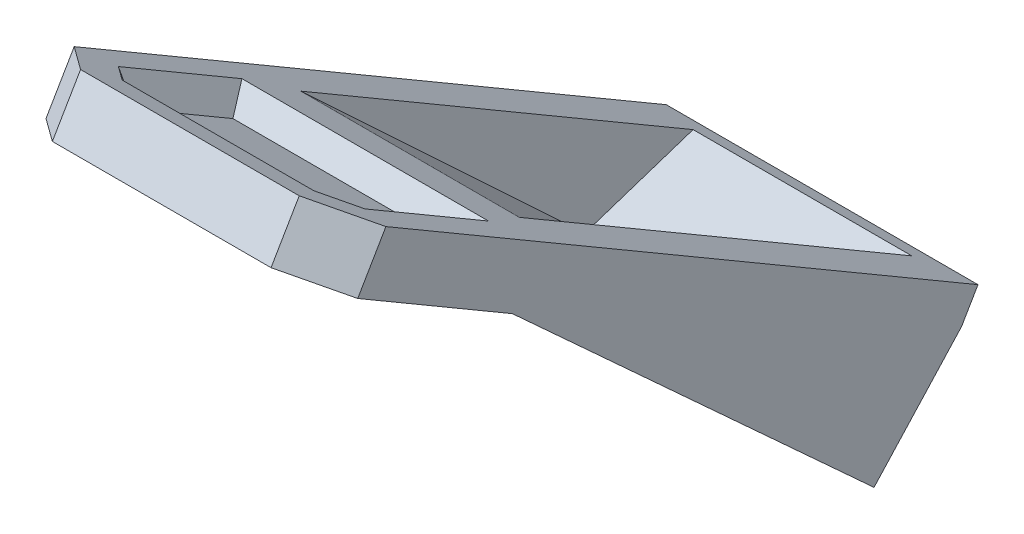
ISO-10303-21;
HEADER;
FILE_DESCRIPTION(('STEP AP214'),'2;1');
FILE_NAME('part.step','',(''),(''),'','','');
FILE_SCHEMA(('AUTOMOTIVE_DESIGN { 1 0 10303 214 1 1 1 1 }'));
ENDSEC;
DATA;
#1=APPLICATION_CONTEXT('core data for automotive mechanical design processes');
#2=APPLICATION_PROTOCOL_DEFINITION('international standard','automotive_design',2000,#1);
#3=PRODUCT_CONTEXT('',#1,'mechanical');
#4=PRODUCT('Part','Part','',(#3));
#5=PRODUCT_RELATED_PRODUCT_CATEGORY('part','',(#4));
#6=PRODUCT_DEFINITION_FORMATION('','',#4);
#7=PRODUCT_DEFINITION_CONTEXT('part definition',#1,'design');
#8=PRODUCT_DEFINITION('design','',#6,#7);
#9=PRODUCT_DEFINITION_SHAPE('','',#8);
#10=(LENGTH_UNIT() NAMED_UNIT(*) SI_UNIT(.MILLI.,.METRE.));
#11=(NAMED_UNIT(*) PLANE_ANGLE_UNIT() SI_UNIT($,.RADIAN.));
#12=(NAMED_UNIT(*) SI_UNIT($,.STERADIAN.) SOLID_ANGLE_UNIT());
#13=UNCERTAINTY_MEASURE_WITH_UNIT(LENGTH_MEASURE(1.E-05),#10,'distance_accuracy_value','');
#14=(GEOMETRIC_REPRESENTATION_CONTEXT(3) GLOBAL_UNCERTAINTY_ASSIGNED_CONTEXT((#13)) GLOBAL_UNIT_ASSIGNED_CONTEXT((#10,
#11,#12)) REPRESENTATION_CONTEXT('',''));
#15=CARTESIAN_POINT('',(0.,0.,0.));
#16=DIRECTION('',(0.,0.,1.));
#17=DIRECTION('',(1.,0.,0.));
#18=AXIS2_PLACEMENT_3D('',#15,#16,#17);
#19=CARTESIAN_POINT('',(-10.6387052127649,82.7152576222763,87.2184204811701));
#20=DIRECTION('',(0.,-0.863175332625444,0.504904293056569));
#21=DIRECTION('',(0.,-0.504904293056569,-0.863175332625445));
#22=AXIS2_PLACEMENT_3D('',#19,#20,#21);
#23=PLANE('',#22);
#24=DIRECTION('',(1.,0.,0.));
#25=VECTOR('',#24,1.);
#26=CARTESIAN_POINT('',(-17.4887052127649,83.1444262713744,87.9521195139018));
#27=LINE('',#26,#25);
#28=CARTESIAN_POINT('',(-16.4887052127649,83.1444262713744,87.9521195139018));
#29=VERTEX_POINT('',#28);
#30=CARTESIAN_POINT('',(-11.7887052127649,83.1444262713744,87.9521195139018));
#31=VERTEX_POINT('',#30);
#32=EDGE_CURVE('E237',#29,#31,#27,.T.);
#33=ORIENTED_EDGE('',*,*,#32,.T.);
#34=DIRECTION('',(-0.707106781186545,0.357021249470501,0.610357131052408));
#35=VECTOR('',#34,1.);
#36=CARTESIAN_POINT('',(-11.7887052127649,83.1444262713744,87.9521195139018));
#37=LINE('',#36,#35);
#38=CARTESIAN_POINT('',(-10.7887052127649,82.6395219783178,87.0889441812763));
#39=VERTEX_POINT('',#38);
#40=EDGE_CURVE('E278',#31,#39,#37,.F.);
#41=ORIENTED_EDGE('',*,*,#40,.T.);
#42=DIRECTION('',(0.,-0.504904293056569,-0.863175332625444));
#43=VECTOR('',#42,1.);
#44=CARTESIAN_POINT('',(-10.7887052127649,75.1953298298224,74.3624866679008));
#45=LINE('',#44,#43);
#46=CARTESIAN_POINT('',(-10.7887052127649,75.1953298298224,74.3624866679008));
#47=VERTEX_POINT('',#46);
#48=EDGE_CURVE('E240',#39,#47,#45,.T.);
#49=ORIENTED_EDGE('',*,*,#48,.T.);
#50=DIRECTION('',(-1.,0.,0.));
#51=VECTOR('',#50,1.);
#52=CARTESIAN_POINT('',(-17.4887052127649,75.1953298298224,74.3624866679008));
#53=LINE('',#52,#51);
#54=CARTESIAN_POINT('',(-17.4887052127649,75.1953298298224,74.3624866679008));
#55=VERTEX_POINT('',#54);
#56=EDGE_CURVE('E204',#47,#55,#53,.T.);
#57=ORIENTED_EDGE('',*,*,#56,.T.);
#58=DIRECTION('',(0.,0.504904293056569,0.863175332625444));
#59=VECTOR('',#58,1.);
#60=CARTESIAN_POINT('',(-17.4887052127649,75.1953298298224,74.3624866679008));
#61=LINE('',#60,#59);
#62=CARTESIAN_POINT('',(-17.4887052127649,82.6395219783178,87.0889441812763));
#63=VERTEX_POINT('',#62);
#64=EDGE_CURVE('E234',#55,#63,#61,.T.);
#65=ORIENTED_EDGE('',*,*,#64,.T.);
#66=DIRECTION('',(-0.707106781186544,-0.357021249470501,-0.610357131052408));
#67=VECTOR('',#66,1.);
#68=CARTESIAN_POINT('',(-17.4887052127649,82.6395219783179,87.0889441812763));
#69=LINE('',#68,#67);
#70=EDGE_CURVE('E276',#63,#29,#69,.F.);
#71=ORIENTED_EDGE('',*,*,#70,.T.);
#72=EDGE_LOOP('',(#33,#41,#49,#57,#65,#71));
#73=FACE_BOUND('',#72,.T.);
#74=DIRECTION('',(1.,0.,0.));
#75=VECTOR('',#74,1.);
#76=CARTESIAN_POINT('',(-16.1987557191037,82.7909932662348,87.347896781064));
#77=LINE('',#76,#75);
#78=CARTESIAN_POINT('',(-16.1987557191037,82.7909932662349,87.347896781064));
#79=VERTEX_POINT('',#78);
#80=CARTESIAN_POINT('',(-12.0786547064261,82.7909932662348,87.347896781064));
#81=VERTEX_POINT('',#80);
#82=EDGE_CURVE('E186',#79,#81,#77,.T.);
#83=ORIENTED_EDGE('',*,*,#82,.F.);
#84=DIRECTION('',(0.70710678118655,0.357021249470506,0.610357131052399));
#85=VECTOR('',#84,1.);
#86=CARTESIAN_POINT('',(-16.7887052127649,82.4931252341988,86.8386669306408));
#87=LINE('',#86,#85);
#88=CARTESIAN_POINT('',(-16.7887052127649,82.4931252341988,86.8386669306408));
#89=VERTEX_POINT('',#88);
#90=EDGE_CURVE('E63',#89,#79,#87,.T.);
#91=ORIENTED_EDGE('',*,*,#90,.F.);
#92=DIRECTION('',(0.,0.504904293056566,0.863175332625446));
#93=VECTOR('',#92,1.);
#94=CARTESIAN_POINT('',(-16.7887052127649,80.9402562620629,84.1839099599034));
#95=LINE('',#94,#93);
#96=CARTESIAN_POINT('',(-16.7887052127649,80.9402562620629,84.1839099599034));
#97=VERTEX_POINT('',#96);
#98=EDGE_CURVE('E198',#97,#89,#95,.T.);
#99=ORIENTED_EDGE('',*,*,#98,.F.);
#100=DIRECTION('',(-1.,0.,0.));
#101=VECTOR('',#100,1.);
#102=CARTESIAN_POINT('',(-16.7887052127649,80.9402562620629,84.1839099599034));
#103=LINE('',#102,#101);
#104=CARTESIAN_POINT('',(-11.4887052127649,80.9402562620629,84.1839099599034));
#105=VERTEX_POINT('',#104);
#106=EDGE_CURVE('E195',#105,#97,#103,.T.);
#107=ORIENTED_EDGE('',*,*,#106,.F.);
#108=DIRECTION('',(0.,-0.50490429305657,-0.863175332625444));
#109=VECTOR('',#108,1.);
#110=CARTESIAN_POINT('',(-11.4887052127649,82.4931252341988,86.8386669306408));
#111=LINE('',#110,#109);
#112=CARTESIAN_POINT('',(-11.4887052127649,82.4931252341988,86.8386669306408));
#113=VERTEX_POINT('',#112);
#114=EDGE_CURVE('E192',#113,#105,#111,.T.);
#115=ORIENTED_EDGE('',*,*,#114,.F.);
#116=DIRECTION('',(0.707106781186537,-0.3570212494705,-0.610357131052417));
#117=VECTOR('',#116,1.);
#118=CARTESIAN_POINT('',(-12.0786547064261,82.7909932662348,87.347896781064));
#119=LINE('',#118,#117);
#120=EDGE_CURVE('E189',#81,#113,#119,.T.);
#121=ORIENTED_EDGE('',*,*,#120,.F.);
#122=EDGE_LOOP('',(#83,#91,#99,#107,#115,#121));
#123=FACE_BOUND('',#122,.T.);
#124=DIRECTION('',(0.,-0.504904293056568,-0.863175332625445));
#125=VECTOR('',#124,1.);
#126=CARTESIAN_POINT('',(-11.7887052127649,80.3781983555233,83.2230258337356));
#127=LINE('',#126,#125);
#128=CARTESIAN_POINT('',(-11.7887052127649,80.3781983555233,83.2230258337356));
#129=VERTEX_POINT('',#128);
#130=CARTESIAN_POINT('',(-11.7887052127649,75.4432239825137,74.7862820696191));
#131=VERTEX_POINT('',#130);
#132=EDGE_CURVE('E170',#129,#131,#127,.T.);
#133=ORIENTED_EDGE('',*,*,#132,.F.);
#134=DIRECTION('',(-1.,0.,0.));
#135=VECTOR('',#134,1.);
#136=CARTESIAN_POINT('',(-11.7887052127649,80.3781983555233,83.2230258337356));
#137=LINE('',#136,#135);
#138=CARTESIAN_POINT('',(-16.4887052127649,80.3781983555233,83.2230258337356));
#139=VERTEX_POINT('',#138);
#140=EDGE_CURVE('E180',#129,#139,#137,.T.);
#141=ORIENTED_EDGE('',*,*,#140,.T.);
#142=DIRECTION('',(0.,-0.504904293056568,-0.863175332625445));
#143=VECTOR('',#142,1.);
#144=CARTESIAN_POINT('',(-16.4887052127649,80.3781983555233,83.2230258337356));
#145=LINE('',#144,#143);
#146=CARTESIAN_POINT('',(-16.4887052127649,75.4432239825137,74.7862820696191));
#147=VERTEX_POINT('',#146);
#148=EDGE_CURVE('E178',#139,#147,#145,.T.);
#149=ORIENTED_EDGE('',*,*,#148,.T.);
#150=DIRECTION('',(-1.,0.,0.));
#151=VECTOR('',#150,1.);
#152=CARTESIAN_POINT('',(-11.7887052127649,75.4432239825137,74.7862820696191));
#153=LINE('',#152,#151);
#154=EDGE_CURVE('E163',#131,#147,#153,.T.);
#155=ORIENTED_EDGE('',*,*,#154,.F.);
#156=EDGE_LOOP('',(#133,#141,#149,#155));
#157=FACE_BOUND('',#156,.T.);
#158=ADVANCED_FACE('F39',(#73,#123,#157),#23,.F.);
#159=CARTESIAN_POINT('',(-10.6387052127649,79.6598300508996,84.3716043023361));
#160=DIRECTION('',(0.,0.737413288655706,-0.67544181223402));
#161=DIRECTION('',(0.,0.67544181223402,0.737413288655706));
#162=AXIS2_PLACEMENT_3D('',#159,#160,#161);
#163=PLANE('',#162);
#164=DIRECTION('',(0.,-0.67544181223402,-0.737413288655706));
#165=VECTOR('',#164,1.);
#166=CARTESIAN_POINT('',(-10.7887052127649,79.6598300508996,84.3716043023361));
#167=LINE('',#166,#165);
#168=CARTESIAN_POINT('',(-10.7887052127649,79.6598300508996,84.3716043023361));
#169=VERTEX_POINT('',#168);
#170=CARTESIAN_POINT('',(-10.7887052127649,72.5386476755693,76.5970567108258));
#171=VERTEX_POINT('',#170);
#172=EDGE_CURVE('E266',#169,#171,#167,.T.);
#173=ORIENTED_EDGE('',*,*,#172,.F.);
#174=DIRECTION('',(-1.,0.,0.));
#175=VECTOR('',#174,1.);
#176=CARTESIAN_POINT('',(-10.6387052127649,79.6598300508996,84.3716043023361));
#177=LINE('',#176,#175);
#178=CARTESIAN_POINT('',(-17.4887052127649,79.6598300508996,84.3716043023361));
#179=VERTEX_POINT('',#178);
#180=EDGE_CURVE('E261',#169,#179,#177,.T.);
#181=ORIENTED_EDGE('',*,*,#180,.T.);
#182=DIRECTION('',(0.,0.67544181223402,0.737413288655706));
#183=VECTOR('',#182,1.);
#184=CARTESIAN_POINT('',(-17.4887052127649,79.6598300508996,84.3716043023361));
#185=LINE('',#184,#183);
#186=CARTESIAN_POINT('',(-17.4887052127649,72.5386476755693,76.5970567108258));
#187=VERTEX_POINT('',#186);
#188=EDGE_CURVE('E264',#187,#179,#185,.T.);
#189=ORIENTED_EDGE('',*,*,#188,.F.);
#190=DIRECTION('',(-1.,0.,0.));
#191=VECTOR('',#190,1.);
#192=CARTESIAN_POINT('',(-10.6387052127649,72.5386476755693,76.5970567108258));
#193=LINE('',#192,#191);
#194=EDGE_CURVE('E258',#171,#187,#193,.T.);
#195=ORIENTED_EDGE('',*,*,#194,.F.);
#196=EDGE_LOOP('',(#173,#181,#189,#195));
#197=FACE_BOUND('',#196,.T.);
#198=ADVANCED_FACE('F320',(#197),#163,.F.);
#199=CARTESIAN_POINT('',(-10.6387052127649,81.6794472231258,87.8243056328379));
#200=DIRECTION('',(0.,0.86317533262546,-0.504904293056542));
#201=DIRECTION('',(0.,0.504904293056542,0.86317533262546));
#202=AXIS2_PLACEMENT_3D('',#199,#200,#201);
#203=PLANE('',#202);
#204=DIRECTION('',(0.,-0.504904293056542,-0.86317533262546));
#205=VECTOR('',#204,1.);
#206=CARTESIAN_POINT('',(-10.7887052127649,81.6794472231258,87.8243056328379));
#207=LINE('',#206,#205);
#208=CARTESIAN_POINT('',(-10.7887052127649,81.6037115791674,87.6948293329442));
#209=VERTEX_POINT('',#208);
#210=EDGE_CURVE('E252',#209,#169,#207,.T.);
#211=ORIENTED_EDGE('',*,*,#210,.F.);
#212=DIRECTION('',(0.707106781186545,-0.357021249470482,-0.610357131052419));
#213=VECTOR('',#212,1.);
#214=CARTESIAN_POINT('',(-11.7887052127651,82.108615872224,88.5580046655698));
#215=LINE('',#214,#213);
#216=CARTESIAN_POINT('',(-11.7887052127649,82.1086158722239,88.5580046655697));
#217=VERTEX_POINT('',#216);
#218=EDGE_CURVE('E48',#209,#217,#215,.F.);
#219=ORIENTED_EDGE('',*,*,#218,.T.);
#220=DIRECTION('',(1.,0.,0.));
#221=VECTOR('',#220,1.);
#222=CARTESIAN_POINT('',(-10.6387052127649,82.1086158722239,88.5580046655697));
#223=LINE('',#222,#221);
#224=CARTESIAN_POINT('',(-16.4887052127649,82.1086158722239,88.5580046655697));
#225=VERTEX_POINT('',#224);
#226=EDGE_CURVE('E268',#225,#217,#223,.T.);
#227=ORIENTED_EDGE('',*,*,#226,.F.);
#228=DIRECTION('',(0.707106781186544,0.357021249470482,0.610357131052419));
#229=VECTOR('',#228,1.);
#230=CARTESIAN_POINT('',(-17.4887052127648,81.6037115791674,87.6948293329443));
#231=LINE('',#230,#229);
#232=CARTESIAN_POINT('',(-17.4887052127649,81.6037115791674,87.6948293329442));
#233=VERTEX_POINT('',#232);
#234=EDGE_CURVE('E282',#225,#233,#231,.F.);
#235=ORIENTED_EDGE('',*,*,#234,.T.);
#236=DIRECTION('',(0.,0.504904293056542,0.86317533262546));
#237=VECTOR('',#236,1.);
#238=CARTESIAN_POINT('',(-17.4887052127649,81.6794472231258,87.8243056328379));
#239=LINE('',#238,#237);
#240=EDGE_CURVE('E246',#179,#233,#239,.T.);
#241=ORIENTED_EDGE('',*,*,#240,.F.);
#242=ORIENTED_EDGE('',*,*,#180,.F.);
#243=EDGE_LOOP('',(#211,#219,#227,#235,#241,#242));
#244=FACE_BOUND('',#243,.T.);
#245=ADVANCED_FACE('F287',(#244),#203,.F.);
#246=CARTESIAN_POINT('',(-10.6387052127649,72.5386476755693,76.5970567108258));
#247=DIRECTION('',(0.,0.67544181223402,0.737413288655706));
#248=DIRECTION('',(0.,-0.737413288655706,0.67544181223402));
#249=AXIS2_PLACEMENT_3D('',#246,#247,#248);
#250=PLANE('',#249);
#251=DIRECTION('',(0.,0.737413288655706,-0.67544181223402));
#252=VECTOR('',#251,1.);
#253=CARTESIAN_POINT('',(-10.7887052127649,72.5386476755693,76.5970567108258));
#254=LINE('',#253,#252);
#255=CARTESIAN_POINT('',(-10.7887052127649,74.5946242471856,74.7138623572568));
#256=VERTEX_POINT('',#255);
#257=EDGE_CURVE('E254',#171,#256,#254,.T.);
#258=ORIENTED_EDGE('',*,*,#257,.F.);
#259=ORIENTED_EDGE('',*,*,#194,.T.);
#260=DIRECTION('',(0.,-0.737413288655706,0.67544181223402));
#261=VECTOR('',#260,1.);
#262=CARTESIAN_POINT('',(-17.4887052127649,72.5386476755693,76.5970567108258));
#263=LINE('',#262,#261);
#264=CARTESIAN_POINT('',(-17.4887052127649,74.5946242471856,74.7138623572568));
#265=VERTEX_POINT('',#264);
#266=EDGE_CURVE('E250',#265,#187,#263,.T.);
#267=ORIENTED_EDGE('',*,*,#266,.F.);
#268=DIRECTION('',(-1.,0.,0.));
#269=VECTOR('',#268,1.);
#270=CARTESIAN_POINT('',(-10.6387052127649,74.5946242471856,74.7138623572568));
#271=LINE('',#270,#269);
#272=EDGE_CURVE('E256',#256,#265,#271,.T.);
#273=ORIENTED_EDGE('',*,*,#272,.F.);
#274=EDGE_LOOP('',(#258,#259,#267,#273));
#275=FACE_BOUND('',#274,.T.);
#276=ADVANCED_FACE('F323',(#275),#250,.F.);
#277=CARTESIAN_POINT('',(-17.4887052127649,66.5635765035679,79.4115295984665));
#278=DIRECTION('',(0.,-0.504904293056569,-0.863175332625444));
#279=DIRECTION('',(0.,0.863175332625445,-0.504904293056569));
#280=AXIS2_PLACEMENT_3D('',#277,#278,#279);
#281=PLANE('',#280);
#282=ORIENTED_EDGE('',*,*,#272,.T.);
#283=DIRECTION('',(0.,0.863175332625444,-0.504904293056569));
#284=VECTOR('',#283,1.);
#285=CARTESIAN_POINT('',(-17.4887052127649,66.5635765035679,79.4115295984665));
#286=LINE('',#285,#284);
#287=EDGE_CURVE('E242',#265,#55,#286,.T.);
#288=ORIENTED_EDGE('',*,*,#287,.T.);
#289=ORIENTED_EDGE('',*,*,#56,.F.);
#290=DIRECTION('',(0.,0.863175332625444,-0.504904293056569));
#291=VECTOR('',#290,1.);
#292=CARTESIAN_POINT('',(-10.7887052127649,66.5635765035679,79.4115295984665));
#293=LINE('',#292,#291);
#294=EDGE_CURVE('E243',#256,#47,#293,.T.);
#295=ORIENTED_EDGE('',*,*,#294,.F.);
#296=EDGE_LOOP('',(#282,#288,#289,#295));
#297=FACE_BOUND('',#296,.T.);
#298=ADVANCED_FACE('F308',(#297),#281,.T.);
#299=CARTESIAN_POINT('',(-17.4887052127649,74.51267294512,93.0011624444675));
#300=DIRECTION('',(0.,0.504904293056569,0.863175332625444));
#301=DIRECTION('',(0.,-0.863175332625445,0.504904293056569));
#302=AXIS2_PLACEMENT_3D('',#299,#300,#301);
#303=PLANE('',#302);
#304=ORIENTED_EDGE('',*,*,#226,.T.);
#305=DIRECTION('',(0.,0.863175332625445,-0.504904293056569));
#306=VECTOR('',#305,1.);
#307=CARTESIAN_POINT('',(-11.7887052127649,74.51267294512,93.0011624444675));
#308=LINE('',#307,#306);
#309=EDGE_CURVE('E273',#217,#31,#308,.T.);
#310=ORIENTED_EDGE('',*,*,#309,.T.);
#311=ORIENTED_EDGE('',*,*,#32,.F.);
#312=DIRECTION('',(0.,-0.863175332625445,0.504904293056569));
#313=VECTOR('',#312,1.);
#314=CARTESIAN_POINT('',(-16.4887052127649,74.51267294512,93.0011624444675));
#315=LINE('',#314,#313);
#316=EDGE_CURVE('E271',#29,#225,#315,.T.);
#317=ORIENTED_EDGE('',*,*,#316,.T.);
#318=EDGE_LOOP('',(#304,#310,#311,#317));
#319=FACE_BOUND('',#318,.T.);
#320=ADVANCED_FACE('F294',(#319),#303,.T.);
#321=CARTESIAN_POINT('',(-10.7887052127649,66.5635765035679,79.4115295984665));
#322=DIRECTION('',(1.,0.,0.));
#323=DIRECTION('',(0.,0.,-1.));
#324=AXIS2_PLACEMENT_3D('',#321,#322,#323);
#325=PLANE('',#324);
#326=ORIENTED_EDGE('',*,*,#48,.F.);
#327=DIRECTION('',(0.,-0.863175332625445,0.504904293056569));
#328=VECTOR('',#327,1.);
#329=CARTESIAN_POINT('',(-10.7887052127649,74.0077686520634,92.137987111842));
#330=LINE('',#329,#328);
#331=EDGE_CURVE('E280',#39,#209,#330,.T.);
#332=ORIENTED_EDGE('',*,*,#331,.T.);
#333=ORIENTED_EDGE('',*,*,#210,.T.);
#334=ORIENTED_EDGE('',*,*,#172,.T.);
#335=ORIENTED_EDGE('',*,*,#257,.T.);
#336=ORIENTED_EDGE('',*,*,#294,.T.);
#337=EDGE_LOOP('',(#326,#332,#333,#334,#335,#336));
#338=FACE_BOUND('',#337,.T.);
#339=ADVANCED_FACE('F302',(#338),#325,.T.);
#340=CARTESIAN_POINT('',(-17.4887052127649,66.5635765035679,79.4115295984665));
#341=DIRECTION('',(-1.,0.,0.));
#342=DIRECTION('',(0.,0.,1.));
#343=AXIS2_PLACEMENT_3D('',#340,#341,#342);
#344=PLANE('',#343);
#345=ORIENTED_EDGE('',*,*,#240,.T.);
#346=DIRECTION('',(0.,0.863175332625445,-0.504904293056569));
#347=VECTOR('',#346,1.);
#348=CARTESIAN_POINT('',(-17.4887052127649,74.0077686520634,92.137987111842));
#349=LINE('',#348,#347);
#350=EDGE_CURVE('E11',#233,#63,#349,.T.);
#351=ORIENTED_EDGE('',*,*,#350,.T.);
#352=ORIENTED_EDGE('',*,*,#64,.F.);
#353=ORIENTED_EDGE('',*,*,#287,.F.);
#354=ORIENTED_EDGE('',*,*,#266,.T.);
#355=ORIENTED_EDGE('',*,*,#188,.T.);
#356=EDGE_LOOP('',(#345,#351,#352,#353,#354,#355));
#357=FACE_BOUND('',#356,.T.);
#358=ADVANCED_FACE('F312',(#357),#344,.T.);
#359=CARTESIAN_POINT('',(-11.7887052127649,74.51267294512,93.0011624444675));
#360=DIRECTION('',(-0.70710678118655,-0.357021249470498,-0.610357131052404));
#361=DIRECTION('',(0.,0.863175332625445,-0.504904293056569));
#362=AXIS2_PLACEMENT_3D('',#359,#360,#361);
#363=PLANE('',#362);
#364=ORIENTED_EDGE('',*,*,#218,.F.);
#365=ORIENTED_EDGE('',*,*,#331,.F.);
#366=ORIENTED_EDGE('',*,*,#40,.F.);
#367=ORIENTED_EDGE('',*,*,#309,.F.);
#368=EDGE_LOOP('',(#364,#365,#366,#367));
#369=FACE_BOUND('',#368,.T.);
#370=ADVANCED_FACE('F297',(#369),#363,.F.);
#371=CARTESIAN_POINT('',(-17.4887052127649,74.0077686520634,92.137987111842));
#372=DIRECTION('',(0.70710678118655,-0.357021249470498,-0.610357131052403));
#373=DIRECTION('',(0.,0.863175332625445,-0.504904293056569));
#374=AXIS2_PLACEMENT_3D('',#371,#372,#373);
#375=PLANE('',#374);
#376=ORIENTED_EDGE('',*,*,#234,.F.);
#377=ORIENTED_EDGE('',*,*,#316,.F.);
#378=ORIENTED_EDGE('',*,*,#70,.F.);
#379=ORIENTED_EDGE('',*,*,#350,.F.);
#380=EDGE_LOOP('',(#376,#377,#378,#379));
#381=FACE_BOUND('',#380,.T.);
#382=ADVANCED_FACE('F42',(#381),#375,.F.);
#383=CARTESIAN_POINT('',(-16.7887052127649,82.4931252341988,86.8386669306408));
#384=DIRECTION('',(-0.533660262001969,-0.296846613252314,0.791889394398372));
#385=DIRECTION('',(0.829268528933703,0.,0.558850343938457));
#386=AXIS2_PLACEMENT_3D('',#383,#384,#385);
#387=PLANE('',#386);
#388=ORIENTED_EDGE('',*,*,#90,.T.);
#389=DIRECTION('',(-0.262238210225381,0.94830254987925,0.178755125773504));
#390=VECTOR('',#389,1.);
#391=CARTESIAN_POINT('',(-16.1413808411257,82.5835149470425,87.3087870970847));
#392=LINE('',#391,#390);
#393=CARTESIAN_POINT('',(-16.0187205409064,82.1399522970118,87.2251754930616));
#394=VERTEX_POINT('',#393);
#395=EDGE_CURVE('E206',#394,#79,#392,.T.);
#396=ORIENTED_EDGE('',*,*,#395,.F.);
#397=DIRECTION('',(0.70710678118655,0.357021249470506,0.610357131052399));
#398=VECTOR('',#397,1.);
#399=CARTESIAN_POINT('',(-66.3910774783329,56.7067330279269,43.7449995384714));
#400=LINE('',#399,#398);
#401=CARTESIAN_POINT('',(-16.3540618438568,81.970637033513,86.9357171523444));
#402=VERTEX_POINT('',#401);
#403=EDGE_CURVE('E201',#402,#394,#400,.T.);
#404=ORIENTED_EDGE('',*,*,#403,.F.);
#405=DIRECTION('',(-0.633099043698571,0.761053322932101,-0.14136279751746));
#406=VECTOR('',#405,1.);
#407=CARTESIAN_POINT('',(-16.2780904360711,81.8793112087174,86.9526805814362));
#408=LINE('',#407,#406);
#409=EDGE_CURVE('E202',#402,#89,#408,.T.);
#410=ORIENTED_EDGE('',*,*,#409,.T.);
#411=EDGE_LOOP('',(#388,#396,#404,#410));
#412=FACE_BOUND('',#411,.T.);
#413=ADVANCED_FACE('F349',(#412),#387,.F.);
#414=CARTESIAN_POINT('',(-16.7887052127649,80.9402562620629,84.1839099599034));
#415=DIRECTION('',(-0.754709580222772,-0.566293970570808,0.33124702023583));
#416=DIRECTION('',(0.600177552610832,-0.799866804750686,0.));
#417=AXIS2_PLACEMENT_3D('',#414,#415,#416);
#418=PLANE('',#417);
#419=ORIENTED_EDGE('',*,*,#98,.T.);
#420=ORIENTED_EDGE('',*,*,#409,.F.);
#421=DIRECTION('',(0.,0.504904293056571,0.863175332625443));
#422=VECTOR('',#421,1.);
#423=CARTESIAN_POINT('',(-16.3540618438563,23.1855929884656,-13.5621408472506));
#424=LINE('',#423,#422);
#425=CARTESIAN_POINT('',(-16.3540618438568,80.7281218986604,84.8115355409625));
#426=VERTEX_POINT('',#425);
#427=EDGE_CURVE('E209',#426,#402,#424,.T.);
#428=ORIENTED_EDGE('',*,*,#427,.F.);
#429=DIRECTION('',(-0.548544827658019,0.267725717535423,-0.792099433290908));
#430=VECTOR('',#429,1.);
#431=CARTESIAN_POINT('',(-16.7887052127649,80.9402562620629,84.1839099599034));
#432=LINE('',#431,#430);
#433=EDGE_CURVE('E205',#426,#97,#432,.T.);
#434=ORIENTED_EDGE('',*,*,#433,.T.);
#435=EDGE_LOOP('',(#419,#420,#428,#434));
#436=FACE_BOUND('',#435,.T.);
#437=ADVANCED_FACE('F345',(#436),#418,.F.);
#438=CARTESIAN_POINT('',(-16.7887052127649,80.9402562620629,84.1839099599034));
#439=DIRECTION('',(0.,-0.947350077636206,-0.32019967270857));
#440=DIRECTION('',(0.,0.32019967270857,-0.947350077636206));
#441=AXIS2_PLACEMENT_3D('',#438,#439,#440);
#442=PLANE('',#441);
#443=ORIENTED_EDGE('',*,*,#106,.T.);
#444=ORIENTED_EDGE('',*,*,#433,.F.);
#445=DIRECTION('',(-1.,0.,0.));
#446=VECTOR('',#445,1.);
#447=CARTESIAN_POINT('',(7.26472126470215E-13,80.7281218986605,84.8115355409623));
#448=LINE('',#447,#446);
#449=CARTESIAN_POINT('',(-11.923348581673,80.7281218986604,84.8115355409624));
#450=VERTEX_POINT('',#449);
#451=EDGE_CURVE('E221',#450,#426,#448,.T.);
#452=ORIENTED_EDGE('',*,*,#451,.F.);
#453=DIRECTION('',(0.54854482765802,0.267725717535423,-0.792099433290907));
#454=VECTOR('',#453,1.);
#455=CARTESIAN_POINT('',(-12.4141489009277,80.4885792742224,85.5202518302043));
#456=LINE('',#455,#454);
#457=EDGE_CURVE('E213',#450,#105,#456,.T.);
#458=ORIENTED_EDGE('',*,*,#457,.T.);
#459=EDGE_LOOP('',(#443,#444,#452,#458));
#460=FACE_BOUND('',#459,.T.);
#461=ADVANCED_FACE('F348',(#460),#442,.F.);
#462=CARTESIAN_POINT('',(-11.4887052127649,82.4931252341988,86.8386669306408));
#463=DIRECTION('',(0.754709580222772,-0.566293970570807,0.331247020235832));
#464=DIRECTION('',(0.600177552610831,0.799866804750687,0.));
#465=AXIS2_PLACEMENT_3D('',#462,#463,#464);
#466=PLANE('',#465);
#467=ORIENTED_EDGE('',*,*,#114,.T.);
#468=ORIENTED_EDGE('',*,*,#457,.F.);
#469=DIRECTION('',(0.,-0.504904293056571,-0.863175332625443));
#470=VECTOR('',#469,1.);
#471=CARTESIAN_POINT('',(-11.9233485816732,23.1855929884656,-13.5621408472506));
#472=LINE('',#471,#470);
#473=CARTESIAN_POINT('',(-11.923348581673,81.970637033513,86.9357171523444));
#474=VERTEX_POINT('',#473);
#475=EDGE_CURVE('E224',#474,#450,#472,.T.);
#476=ORIENTED_EDGE('',*,*,#475,.F.);
#477=DIRECTION('',(0.633099043698572,0.761053322932098,-0.141362797517469));
#478=VECTOR('',#477,1.);
#479=CARTESIAN_POINT('',(-11.627220421319,82.3266150162543,86.8695955784958));
#480=LINE('',#479,#478);
#481=EDGE_CURVE('E211',#474,#113,#480,.T.);
#482=ORIENTED_EDGE('',*,*,#481,.T.);
#483=EDGE_LOOP('',(#467,#468,#476,#482));
#484=FACE_BOUND('',#483,.T.);
#485=ADVANCED_FACE('F353',(#484),#466,.F.);
#486=CARTESIAN_POINT('',(-12.0786547064261,82.7909932662348,87.347896781064));
#487=DIRECTION('',(0.533660262001985,-0.296846613252322,0.791889394398359));
#488=DIRECTION('',(0.829268528933691,0.,-0.558850343938476));
#489=AXIS2_PLACEMENT_3D('',#486,#487,#488);
#490=PLANE('',#489);
#491=ORIENTED_EDGE('',*,*,#120,.T.);
#492=ORIENTED_EDGE('',*,*,#481,.F.);
#493=DIRECTION('',(0.707106781186537,-0.3570212494705,-0.610357131052417));
#494=VECTOR('',#493,1.);
#495=CARTESIAN_POINT('',(52.2523722655676,49.5680400677408,31.5408179635479));
#496=LINE('',#495,#494);
#497=CARTESIAN_POINT('',(-12.2586898846234,82.1399522970118,87.2251754930616));
#498=VERTEX_POINT('',#497);
#499=EDGE_CURVE('E227',#498,#474,#496,.T.);
#500=ORIENTED_EDGE('',*,*,#499,.F.);
#501=DIRECTION('',(0.262238210225392,0.948302549879247,0.178755125773503));
#502=VECTOR('',#501,1.);
#503=CARTESIAN_POINT('',(-12.3619894340318,81.7664017529427,87.1547611780348));
#504=LINE('',#503,#502);
#505=EDGE_CURVE('E208',#498,#81,#504,.T.);
#506=ORIENTED_EDGE('',*,*,#505,.T.);
#507=EDGE_LOOP('',(#491,#492,#500,#506));
#508=FACE_BOUND('',#507,.T.);
#509=ADVANCED_FACE('F357',(#508),#490,.F.);
#510=CARTESIAN_POINT('',(-16.1987557191037,82.7909932662348,87.347896781064));
#511=DIRECTION('',(0.,-0.185237863505409,0.982693713180232));
#512=DIRECTION('',(0.,-0.982693713180232,-0.185237863505409));
#513=AXIS2_PLACEMENT_3D('',#510,#511,#512);
#514=PLANE('',#513);
#515=ORIENTED_EDGE('',*,*,#82,.T.);
#516=ORIENTED_EDGE('',*,*,#505,.F.);
#517=DIRECTION('',(1.,0.,0.));
#518=VECTOR('',#517,1.);
#519=CARTESIAN_POINT('',(-1.30547039367074E-12,82.139952297012,87.2251754930616));
#520=LINE('',#519,#518);
#521=EDGE_CURVE('E218',#394,#498,#520,.T.);
#522=ORIENTED_EDGE('',*,*,#521,.F.);
#523=ORIENTED_EDGE('',*,*,#395,.T.);
#524=EDGE_LOOP('',(#515,#516,#522,#523));
#525=FACE_BOUND('',#524,.T.);
#526=ADVANCED_FACE('F361',(#525),#514,.F.);
#527=CARTESIAN_POINT('',(-2.77186537695329E-13,23.1855929884657,-13.5621408472506));
#528=DIRECTION('',(0.,0.863175332625443,-0.504904293056571));
#529=DIRECTION('',(0.,0.504904293056571,0.863175332625443));
#530=AXIS2_PLACEMENT_3D('',#527,#528,#529);
#531=PLANE('',#530);
#532=ORIENTED_EDGE('',*,*,#403,.T.);
#533=ORIENTED_EDGE('',*,*,#521,.T.);
#534=ORIENTED_EDGE('',*,*,#499,.T.);
#535=ORIENTED_EDGE('',*,*,#475,.T.);
#536=ORIENTED_EDGE('',*,*,#451,.T.);
#537=ORIENTED_EDGE('',*,*,#427,.T.);
#538=EDGE_LOOP('',(#532,#533,#534,#535,#536,#537));
#539=FACE_BOUND('',#538,.T.);
#540=ADVANCED_FACE('F365',(#539),#531,.T.);
#541=CARTESIAN_POINT('',(-11.7887052127649,74.6778921575178,77.1139298915459));
#542=DIRECTION('',(0.,-0.731145805581446,0.682221233164622));
#543=DIRECTION('',(0.,-0.682221233164622,-0.731145805581446));
#544=AXIS2_PLACEMENT_3D('',#541,#542,#543);
#545=PLANE('',#544);
#546=DIRECTION('',(0.,0.682221233164622,0.731145805581446));
#547=VECTOR('',#546,1.);
#548=CARTESIAN_POINT('',(-16.4887052127649,74.6778921575178,77.1139298915459));
#549=LINE('',#548,#547);
#550=CARTESIAN_POINT('',(-16.4887052127649,74.6778921575178,77.1139298915459));
#551=VERTEX_POINT('',#550);
#552=EDGE_CURVE('E176',#551,#139,#549,.T.);
#553=ORIENTED_EDGE('',*,*,#552,.T.);
#554=ORIENTED_EDGE('',*,*,#140,.F.);
#555=DIRECTION('',(0.,0.682221233164622,0.731145805581446));
#556=VECTOR('',#555,1.);
#557=CARTESIAN_POINT('',(-11.7887052127649,74.6778921575178,77.1139298915459));
#558=LINE('',#557,#556);
#559=CARTESIAN_POINT('',(-11.7887052127649,74.6778921575178,77.1139298915459));
#560=VERTEX_POINT('',#559);
#561=EDGE_CURVE('E169',#560,#129,#558,.T.);
#562=ORIENTED_EDGE('',*,*,#561,.F.);
#563=DIRECTION('',(-1.,0.,0.));
#564=VECTOR('',#563,1.);
#565=CARTESIAN_POINT('',(-11.7887052127649,74.6778921575178,77.1139298915459));
#566=LINE('',#565,#564);
#567=EDGE_CURVE('E165',#560,#551,#566,.T.);
#568=ORIENTED_EDGE('',*,*,#567,.T.);
#569=EDGE_LOOP('',(#553,#554,#562,#568));
#570=FACE_BOUND('',#569,.T.);
#571=ADVANCED_FACE('F371',(#570),#545,.F.);
#572=CARTESIAN_POINT('',(-11.7887052127649,75.4432239825137,74.7862820696191));
#573=DIRECTION('',(0.,-0.949967188245015,-0.312349709873179));
#574=DIRECTION('',(0.,0.312349709873179,-0.949967188245015));
#575=AXIS2_PLACEMENT_3D('',#572,#573,#574);
#576=PLANE('',#575);
#577=DIRECTION('',(0.,-0.312349709873179,0.949967188245015));
#578=VECTOR('',#577,1.);
#579=CARTESIAN_POINT('',(-16.4887052127649,75.4432239825137,74.7862820696191));
#580=LINE('',#579,#578);
#581=EDGE_CURVE('E55',#147,#551,#580,.T.);
#582=ORIENTED_EDGE('',*,*,#581,.T.);
#583=ORIENTED_EDGE('',*,*,#567,.F.);
#584=DIRECTION('',(0.,-0.312349709873179,0.949967188245015));
#585=VECTOR('',#584,1.);
#586=CARTESIAN_POINT('',(-11.7887052127649,75.4432239825137,74.7862820696191));
#587=LINE('',#586,#585);
#588=EDGE_CURVE('E159',#131,#560,#587,.T.);
#589=ORIENTED_EDGE('',*,*,#588,.F.);
#590=ORIENTED_EDGE('',*,*,#154,.T.);
#591=EDGE_LOOP('',(#582,#583,#589,#590));
#592=FACE_BOUND('',#591,.T.);
#593=ADVANCED_FACE('F161',(#592),#576,.F.);
#594=CARTESIAN_POINT('',(-11.7887052127649,0.,0.));
#595=DIRECTION('',(-1.,0.,0.));
#596=DIRECTION('',(0.,0.,1.));
#597=AXIS2_PLACEMENT_3D('',#594,#595,#596);
#598=PLANE('',#597);
#599=ORIENTED_EDGE('',*,*,#132,.T.);
#600=ORIENTED_EDGE('',*,*,#588,.T.);
#601=ORIENTED_EDGE('',*,*,#561,.T.);
#602=EDGE_LOOP('',(#599,#600,#601));
#603=FACE_BOUND('',#602,.T.);
#604=ADVANCED_FACE('F173',(#603),#598,.T.);
#605=CARTESIAN_POINT('',(-16.4887052127649,0.,0.));
#606=DIRECTION('',(-1.,0.,0.));
#607=DIRECTION('',(0.,0.,1.));
#608=AXIS2_PLACEMENT_3D('',#605,#606,#607);
#609=PLANE('',#608);
#610=ORIENTED_EDGE('',*,*,#148,.F.);
#611=ORIENTED_EDGE('',*,*,#552,.F.);
#612=ORIENTED_EDGE('',*,*,#581,.F.);
#613=EDGE_LOOP('',(#610,#611,#612));
#614=FACE_BOUND('',#613,.T.);
#615=ADVANCED_FACE('F378',(#614),#609,.F.);
#616=CLOSED_SHELL('',(#158,#198,#245,#276,#298,#320,#339,#358,#370,#382,#413,#437,#461,#485,
#509,#526,#540,#571,#593,#604,#615));
#617=MANIFOLD_SOLID_BREP('B2',#616);
#618=ADVANCED_BREP_SHAPE_REPRESENTATION('',(#18,#617),#14);
#619=SHAPE_DEFINITION_REPRESENTATION(#9,#618);
ENDSEC;
END-ISO-10303-21;
